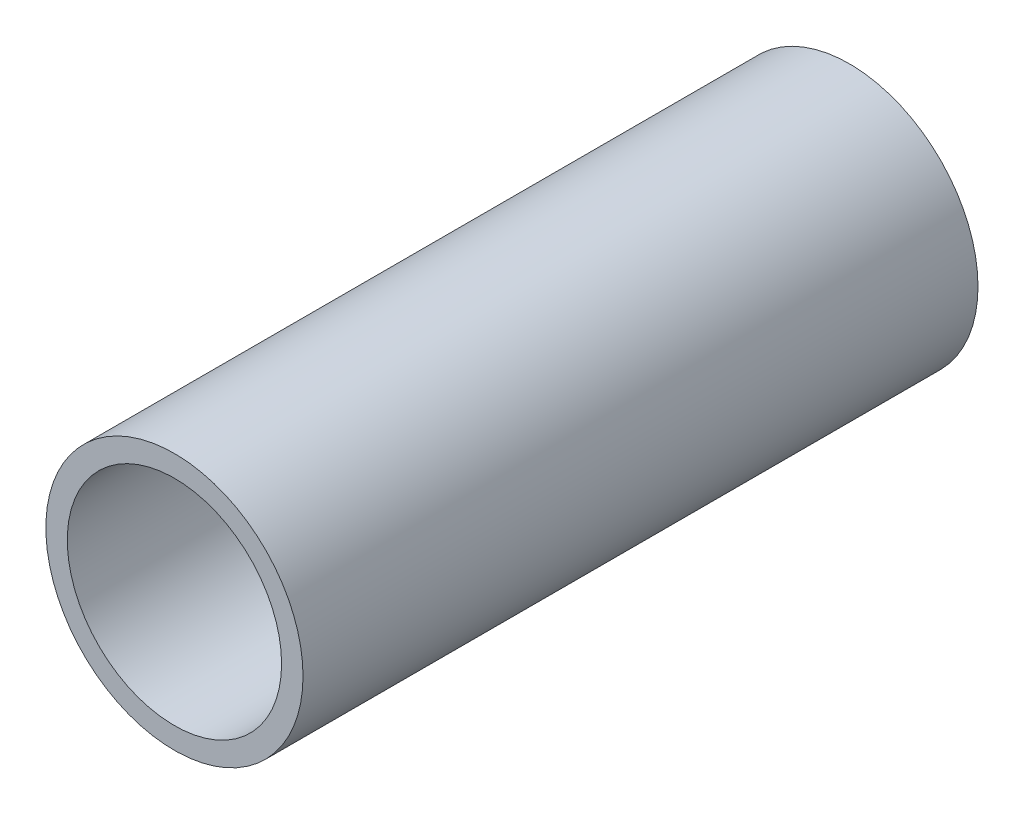
ISO-10303-21;
HEADER;
FILE_DESCRIPTION(('STEP AP214'),'2;1');
FILE_NAME('part.step','',(''),(''),'','','');
FILE_SCHEMA(('AUTOMOTIVE_DESIGN { 1 0 10303 214 1 1 1 1 }'));
ENDSEC;
DATA;
#1=APPLICATION_CONTEXT('core data for automotive mechanical design processes');
#2=APPLICATION_PROTOCOL_DEFINITION('international standard','automotive_design',2000,#1);
#3=PRODUCT_CONTEXT('',#1,'mechanical');
#4=PRODUCT('Part','Part','',(#3));
#5=PRODUCT_RELATED_PRODUCT_CATEGORY('part','',(#4));
#6=PRODUCT_DEFINITION_FORMATION('','',#4);
#7=PRODUCT_DEFINITION_CONTEXT('part definition',#1,'design');
#8=PRODUCT_DEFINITION('design','',#6,#7);
#9=PRODUCT_DEFINITION_SHAPE('','',#8);
#10=(LENGTH_UNIT() NAMED_UNIT(*) SI_UNIT(.MILLI.,.METRE.));
#11=(NAMED_UNIT(*) PLANE_ANGLE_UNIT() SI_UNIT($,.RADIAN.));
#12=(NAMED_UNIT(*) SI_UNIT($,.STERADIAN.) SOLID_ANGLE_UNIT());
#13=UNCERTAINTY_MEASURE_WITH_UNIT(LENGTH_MEASURE(1.E-05),#10,'distance_accuracy_value','');
#14=(GEOMETRIC_REPRESENTATION_CONTEXT(3) GLOBAL_UNCERTAINTY_ASSIGNED_CONTEXT((#13)) GLOBAL_UNIT_ASSIGNED_CONTEXT((#10,
#11,#12)) REPRESENTATION_CONTEXT('',''));
#15=CARTESIAN_POINT('',(0.,0.,0.));
#16=DIRECTION('',(0.,0.,1.));
#17=DIRECTION('',(1.,0.,0.));
#18=AXIS2_PLACEMENT_3D('',#15,#16,#17);
#19=CARTESIAN_POINT('',(0.,0.,-100.));
#20=DIRECTION('',(0.,0.,1.));
#21=DIRECTION('',(1.,0.,0.));
#22=AXIS2_PLACEMENT_3D('',#19,#20,#21);
#23=CYLINDRICAL_SURFACE('',#22,19.05);
#24=CARTESIAN_POINT('',(0.,0.,-100.));
#25=DIRECTION('',(0.,0.,1.));
#26=DIRECTION('',(1.,0.,0.));
#27=AXIS2_PLACEMENT_3D('',#24,#25,#26);
#28=CIRCLE('',#27,19.05);
#29=CARTESIAN_POINT('',(19.05,0.,-100.));
#30=VERTEX_POINT('',#29);
#31=EDGE_CURVE('E11',#30,#30,#28,.T.);
#32=ORIENTED_EDGE('',*,*,#31,.T.);
#33=EDGE_LOOP('',(#32));
#34=FACE_BOUND('',#33,.T.);
#35=CARTESIAN_POINT('',(0.,0.,0.));
#36=DIRECTION('',(0.,0.,1.));
#37=DIRECTION('',(1.,0.,0.));
#38=AXIS2_PLACEMENT_3D('',#35,#36,#37);
#39=CIRCLE('',#38,19.05);
#40=CARTESIAN_POINT('',(19.05,0.,0.));
#41=VERTEX_POINT('',#40);
#42=EDGE_CURVE('E40',#41,#41,#39,.T.);
#43=ORIENTED_EDGE('',*,*,#42,.F.);
#44=EDGE_LOOP('',(#43));
#45=FACE_BOUND('',#44,.T.);
#46=ADVANCED_FACE('F37',(#34,#45),#23,.T.);
#47=CARTESIAN_POINT('',(0.,0.,-100.));
#48=DIRECTION('',(0.,0.,1.));
#49=DIRECTION('',(1.,0.,0.));
#50=AXIS2_PLACEMENT_3D('',#47,#48,#49);
#51=PLANE('',#50);
#52=CARTESIAN_POINT('',(0.,0.,-100.));
#53=DIRECTION('',(0.,0.,1.));
#54=DIRECTION('',(1.,0.,0.));
#55=AXIS2_PLACEMENT_3D('',#52,#53,#54);
#56=CIRCLE('',#55,15.875);
#57=CARTESIAN_POINT('',(15.875,0.,-100.));
#58=VERTEX_POINT('',#57);
#59=EDGE_CURVE('E47',#58,#58,#56,.T.);
#60=ORIENTED_EDGE('',*,*,#59,.T.);
#61=EDGE_LOOP('',(#60));
#62=FACE_BOUND('',#61,.T.);
#63=ORIENTED_EDGE('',*,*,#31,.F.);
#64=EDGE_LOOP('',(#63));
#65=FACE_BOUND('',#64,.T.);
#66=ADVANCED_FACE('F55',(#62,#65),#51,.F.);
#67=CARTESIAN_POINT('',(0.,0.,0.));
#68=DIRECTION('',(0.,0.,1.));
#69=DIRECTION('',(1.,0.,0.));
#70=AXIS2_PLACEMENT_3D('',#67,#68,#69);
#71=PLANE('',#70);
#72=CARTESIAN_POINT('',(0.,0.,0.));
#73=DIRECTION('',(0.,0.,1.));
#74=DIRECTION('',(1.,0.,0.));
#75=AXIS2_PLACEMENT_3D('',#72,#73,#74);
#76=CIRCLE('',#75,15.875);
#77=CARTESIAN_POINT('',(15.875,0.,0.));
#78=VERTEX_POINT('',#77);
#79=EDGE_CURVE('E49',#78,#78,#76,.T.);
#80=ORIENTED_EDGE('',*,*,#79,.F.);
#81=EDGE_LOOP('',(#80));
#82=FACE_BOUND('',#81,.T.);
#83=ORIENTED_EDGE('',*,*,#42,.T.);
#84=EDGE_LOOP('',(#83));
#85=FACE_BOUND('',#84,.T.);
#86=ADVANCED_FACE('F61',(#82,#85),#71,.T.);
#87=CARTESIAN_POINT('',(0.,0.,-100.));
#88=DIRECTION('',(0.,0.,1.));
#89=DIRECTION('',(1.,0.,0.));
#90=AXIS2_PLACEMENT_3D('',#87,#88,#89);
#91=CYLINDRICAL_SURFACE('',#90,15.875);
#92=ORIENTED_EDGE('',*,*,#59,.F.);
#93=EDGE_LOOP('',(#92));
#94=FACE_BOUND('',#93,.T.);
#95=ORIENTED_EDGE('',*,*,#79,.T.);
#96=EDGE_LOOP('',(#95));
#97=FACE_BOUND('',#96,.T.);
#98=ADVANCED_FACE('F58',(#94,#97),#91,.F.);
#99=CLOSED_SHELL('',(#46,#66,#86,#98));
#100=MANIFOLD_SOLID_BREP('B2',#99);
#101=ADVANCED_BREP_SHAPE_REPRESENTATION('',(#18,#100),#14);
#102=SHAPE_DEFINITION_REPRESENTATION(#9,#101);
ENDSEC;
END-ISO-10303-21;
